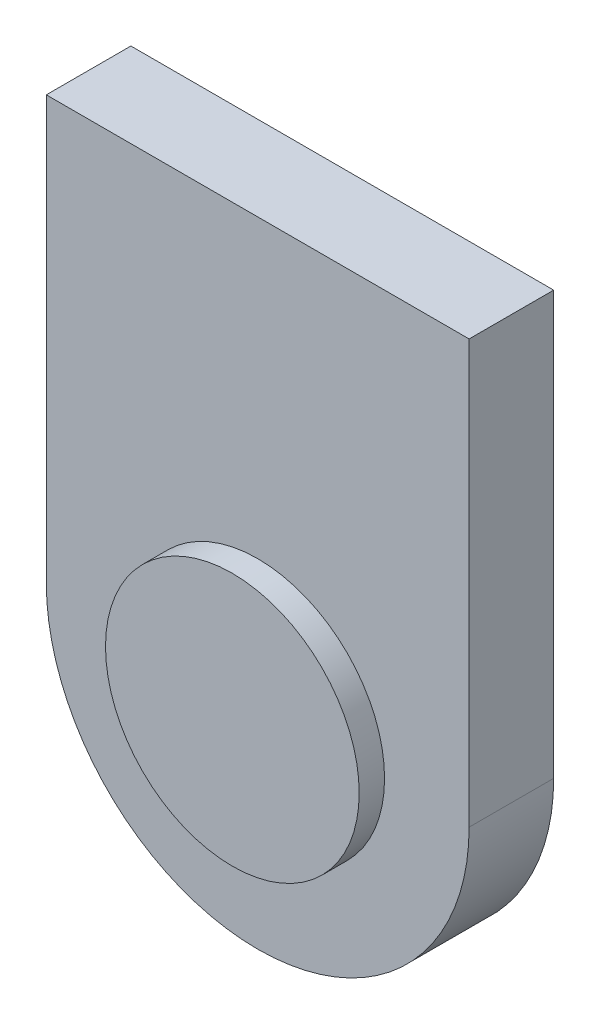
ISO-10303-21;
HEADER;
FILE_DESCRIPTION(('STEP AP214'),'2;1');
FILE_NAME('part.step','',(''),(''),'','','');
FILE_SCHEMA(('AUTOMOTIVE_DESIGN { 1 0 10303 214 1 1 1 1 }'));
ENDSEC;
DATA;
#1=APPLICATION_CONTEXT('core data for automotive mechanical design processes');
#2=APPLICATION_PROTOCOL_DEFINITION('international standard','automotive_design',2000,#1);
#3=PRODUCT_CONTEXT('',#1,'mechanical');
#4=PRODUCT('Part','Part','',(#3));
#5=PRODUCT_RELATED_PRODUCT_CATEGORY('part','',(#4));
#6=PRODUCT_DEFINITION_FORMATION('','',#4);
#7=PRODUCT_DEFINITION_CONTEXT('part definition',#1,'design');
#8=PRODUCT_DEFINITION('design','',#6,#7);
#9=PRODUCT_DEFINITION_SHAPE('','',#8);
#10=(LENGTH_UNIT() NAMED_UNIT(*) SI_UNIT(.MILLI.,.METRE.));
#11=(NAMED_UNIT(*) PLANE_ANGLE_UNIT() SI_UNIT($,.RADIAN.));
#12=(NAMED_UNIT(*) SI_UNIT($,.STERADIAN.) SOLID_ANGLE_UNIT());
#13=UNCERTAINTY_MEASURE_WITH_UNIT(LENGTH_MEASURE(1.E-05),#10,'distance_accuracy_value','');
#14=(GEOMETRIC_REPRESENTATION_CONTEXT(3) GLOBAL_UNCERTAINTY_ASSIGNED_CONTEXT((#13)) GLOBAL_UNIT_ASSIGNED_CONTEXT((#10,
#11,#12)) REPRESENTATION_CONTEXT('',''));
#15=CARTESIAN_POINT('',(0.,0.,0.));
#16=DIRECTION('',(0.,0.,1.));
#17=DIRECTION('',(1.,0.,0.));
#18=AXIS2_PLACEMENT_3D('',#15,#16,#17);
#19=CARTESIAN_POINT('',(0.,0.,5.));
#20=DIRECTION('',(0.,0.,-1.));
#21=DIRECTION('',(-1.,0.,0.));
#22=AXIS2_PLACEMENT_3D('',#19,#20,#21);
#23=CYLINDRICAL_SURFACE('',#22,25.);
#24=CARTESIAN_POINT('',(0.,0.,-5.));
#25=DIRECTION('',(0.,0.,1.));
#26=DIRECTION('',(1.,0.,0.));
#27=AXIS2_PLACEMENT_3D('',#24,#25,#26);
#28=CIRCLE('',#27,25.);
#29=CARTESIAN_POINT('',(-25.,0.,-5.));
#30=VERTEX_POINT('',#29);
#31=CARTESIAN_POINT('',(25.,0.,-5.));
#32=VERTEX_POINT('',#31);
#33=EDGE_CURVE('E110',#30,#32,#28,.T.);
#34=ORIENTED_EDGE('',*,*,#33,.T.);
#35=DIRECTION('',(0.,0.,-1.));
#36=VECTOR('',#35,1.);
#37=CARTESIAN_POINT('',(25.,0.,5.));
#38=LINE('',#37,#36);
#39=CARTESIAN_POINT('',(25.,0.,5.));
#40=VERTEX_POINT('',#39);
#41=EDGE_CURVE('E42',#40,#32,#38,.T.);
#42=ORIENTED_EDGE('',*,*,#41,.F.);
#43=CARTESIAN_POINT('',(0.,0.,5.));
#44=DIRECTION('',(0.,0.,1.));
#45=DIRECTION('',(1.,0.,0.));
#46=AXIS2_PLACEMENT_3D('',#43,#44,#45);
#47=CIRCLE('',#46,25.);
#48=CARTESIAN_POINT('',(-25.,0.,5.));
#49=VERTEX_POINT('',#48);
#50=EDGE_CURVE('E93',#49,#40,#47,.T.);
#51=ORIENTED_EDGE('',*,*,#50,.F.);
#52=DIRECTION('',(0.,0.,-1.));
#53=VECTOR('',#52,1.);
#54=CARTESIAN_POINT('',(-25.,0.,5.));
#55=LINE('',#54,#53);
#56=EDGE_CURVE('E106',#49,#30,#55,.T.);
#57=ORIENTED_EDGE('',*,*,#56,.T.);
#58=EDGE_LOOP('',(#34,#42,#51,#57));
#59=FACE_BOUND('',#58,.T.);
#60=ADVANCED_FACE('F39',(#59),#23,.T.);
#61=CARTESIAN_POINT('',(25.,50.,5.));
#62=DIRECTION('',(-1.,0.,0.));
#63=DIRECTION('',(0.,0.,1.));
#64=AXIS2_PLACEMENT_3D('',#61,#62,#63);
#65=PLANE('',#64);
#66=DIRECTION('',(0.,1.,0.));
#67=VECTOR('',#66,1.);
#68=CARTESIAN_POINT('',(25.,50.,-5.));
#69=LINE('',#68,#67);
#70=CARTESIAN_POINT('',(25.,50.,-5.));
#71=VERTEX_POINT('',#70);
#72=EDGE_CURVE('E99',#32,#71,#69,.T.);
#73=ORIENTED_EDGE('',*,*,#72,.T.);
#74=DIRECTION('',(0.,0.,-1.));
#75=VECTOR('',#74,1.);
#76=CARTESIAN_POINT('',(25.,50.,5.));
#77=LINE('',#76,#75);
#78=CARTESIAN_POINT('',(25.,50.,5.));
#79=VERTEX_POINT('',#78);
#80=EDGE_CURVE('E97',#79,#71,#77,.T.);
#81=ORIENTED_EDGE('',*,*,#80,.F.);
#82=DIRECTION('',(0.,1.,0.));
#83=VECTOR('',#82,1.);
#84=CARTESIAN_POINT('',(25.,50.,5.));
#85=LINE('',#84,#83);
#86=EDGE_CURVE('E88',#40,#79,#85,.T.);
#87=ORIENTED_EDGE('',*,*,#86,.F.);
#88=ORIENTED_EDGE('',*,*,#41,.T.);
#89=EDGE_LOOP('',(#73,#81,#87,#88));
#90=FACE_BOUND('',#89,.T.);
#91=ADVANCED_FACE('F98',(#90),#65,.F.);
#92=CARTESIAN_POINT('',(-25.,50.,5.));
#93=DIRECTION('',(0.,-1.,0.));
#94=DIRECTION('',(0.,0.,-1.));
#95=AXIS2_PLACEMENT_3D('',#92,#93,#94);
#96=PLANE('',#95);
#97=DIRECTION('',(-1.,0.,0.));
#98=VECTOR('',#97,1.);
#99=CARTESIAN_POINT('',(-25.,50.,-5.));
#100=LINE('',#99,#98);
#101=CARTESIAN_POINT('',(-25.,50.,-5.));
#102=VERTEX_POINT('',#101);
#103=EDGE_CURVE('E74',#71,#102,#100,.T.);
#104=ORIENTED_EDGE('',*,*,#103,.T.);
#105=DIRECTION('',(0.,0.,-1.));
#106=VECTOR('',#105,1.);
#107=CARTESIAN_POINT('',(-25.,50.,5.));
#108=LINE('',#107,#106);
#109=CARTESIAN_POINT('',(-25.,50.,5.));
#110=VERTEX_POINT('',#109);
#111=EDGE_CURVE('E101',#110,#102,#108,.T.);
#112=ORIENTED_EDGE('',*,*,#111,.F.);
#113=DIRECTION('',(-1.,0.,0.));
#114=VECTOR('',#113,1.);
#115=CARTESIAN_POINT('',(-25.,50.,5.));
#116=LINE('',#115,#114);
#117=EDGE_CURVE('E91',#79,#110,#116,.T.);
#118=ORIENTED_EDGE('',*,*,#117,.F.);
#119=ORIENTED_EDGE('',*,*,#80,.T.);
#120=EDGE_LOOP('',(#104,#112,#118,#119));
#121=FACE_BOUND('',#120,.T.);
#122=ADVANCED_FACE('F102',(#121),#96,.F.);
#123=CARTESIAN_POINT('',(-25.,0.,5.));
#124=DIRECTION('',(1.,0.,0.));
#125=DIRECTION('',(0.,0.,-1.));
#126=AXIS2_PLACEMENT_3D('',#123,#124,#125);
#127=PLANE('',#126);
#128=DIRECTION('',(0.,-1.,0.));
#129=VECTOR('',#128,1.);
#130=CARTESIAN_POINT('',(-25.,0.,-5.));
#131=LINE('',#130,#129);
#132=EDGE_CURVE('E80',#102,#30,#131,.T.);
#133=ORIENTED_EDGE('',*,*,#132,.T.);
#134=ORIENTED_EDGE('',*,*,#56,.F.);
#135=DIRECTION('',(0.,-1.,0.));
#136=VECTOR('',#135,1.);
#137=CARTESIAN_POINT('',(-25.,0.,5.));
#138=LINE('',#137,#136);
#139=EDGE_CURVE('E57',#110,#49,#138,.T.);
#140=ORIENTED_EDGE('',*,*,#139,.F.);
#141=ORIENTED_EDGE('',*,*,#111,.T.);
#142=EDGE_LOOP('',(#133,#134,#140,#141));
#143=FACE_BOUND('',#142,.T.);
#144=ADVANCED_FACE('F124',(#143),#127,.F.);
#145=CARTESIAN_POINT('',(0.,0.,5.));
#146=DIRECTION('',(0.,0.,1.));
#147=DIRECTION('',(1.,0.,0.));
#148=AXIS2_PLACEMENT_3D('',#145,#146,#147);
#149=PLANE('',#148);
#150=CARTESIAN_POINT('',(0.,0.,5.));
#151=DIRECTION('',(0.,0.,1.));
#152=DIRECTION('',(1.,0.,0.));
#153=AXIS2_PLACEMENT_3D('',#150,#151,#152);
#154=CIRCLE('',#153,15.);
#155=CARTESIAN_POINT('',(15.,0.,5.));
#156=VERTEX_POINT('',#155);
#157=EDGE_CURVE('E11',#156,#156,#154,.T.);
#158=ORIENTED_EDGE('',*,*,#157,.F.);
#159=EDGE_LOOP('',(#158));
#160=FACE_BOUND('',#159,.T.);
#161=ORIENTED_EDGE('',*,*,#50,.T.);
#162=ORIENTED_EDGE('',*,*,#86,.T.);
#163=ORIENTED_EDGE('',*,*,#117,.T.);
#164=ORIENTED_EDGE('',*,*,#139,.T.);
#165=EDGE_LOOP('',(#161,#162,#163,#164));
#166=FACE_BOUND('',#165,.T.);
#167=ADVANCED_FACE('F89',(#160,#166),#149,.T.);
#168=CARTESIAN_POINT('',(0.,0.,-5.));
#169=DIRECTION('',(0.,0.,1.));
#170=DIRECTION('',(1.,0.,0.));
#171=AXIS2_PLACEMENT_3D('',#168,#169,#170);
#172=PLANE('',#171);
#173=ORIENTED_EDGE('',*,*,#33,.F.);
#174=ORIENTED_EDGE('',*,*,#132,.F.);
#175=ORIENTED_EDGE('',*,*,#103,.F.);
#176=ORIENTED_EDGE('',*,*,#72,.F.);
#177=EDGE_LOOP('',(#173,#174,#175,#176));
#178=FACE_BOUND('',#177,.T.);
#179=ADVANCED_FACE('F127',(#178),#172,.F.);
#180=CARTESIAN_POINT('',(0.,0.,8.));
#181=DIRECTION('',(0.,0.,-1.));
#182=DIRECTION('',(-1.,0.,0.));
#183=AXIS2_PLACEMENT_3D('',#180,#181,#182);
#184=CYLINDRICAL_SURFACE('',#183,15.);
#185=CARTESIAN_POINT('',(0.,0.,8.));
#186=DIRECTION('',(0.,0.,1.));
#187=DIRECTION('',(1.,0.,0.));
#188=AXIS2_PLACEMENT_3D('',#185,#186,#187);
#189=CIRCLE('',#188,15.);
#190=CARTESIAN_POINT('',(15.,0.,8.));
#191=VERTEX_POINT('',#190);
#192=EDGE_CURVE('E114',#191,#191,#189,.T.);
#193=ORIENTED_EDGE('',*,*,#192,.F.);
#194=EDGE_LOOP('',(#193));
#195=FACE_BOUND('',#194,.T.);
#196=ORIENTED_EDGE('',*,*,#157,.T.);
#197=EDGE_LOOP('',(#196));
#198=FACE_BOUND('',#197,.T.);
#199=ADVANCED_FACE('F137',(#195,#198),#184,.T.);
#200=CARTESIAN_POINT('',(0.,0.,8.));
#201=DIRECTION('',(0.,0.,1.));
#202=DIRECTION('',(1.,0.,0.));
#203=AXIS2_PLACEMENT_3D('',#200,#201,#202);
#204=PLANE('',#203);
#205=ORIENTED_EDGE('',*,*,#192,.T.);
#206=EDGE_LOOP('',(#205));
#207=FACE_BOUND('',#206,.T.);
#208=ADVANCED_FACE('F135',(#207),#204,.T.);
#209=CLOSED_SHELL('',(#60,#91,#122,#144,#167,#179,#199,#208));
#210=MANIFOLD_SOLID_BREP('B2',#209);
#211=ADVANCED_BREP_SHAPE_REPRESENTATION('',(#18,#210),#14);
#212=SHAPE_DEFINITION_REPRESENTATION(#9,#211);
ENDSEC;
END-ISO-10303-21;
